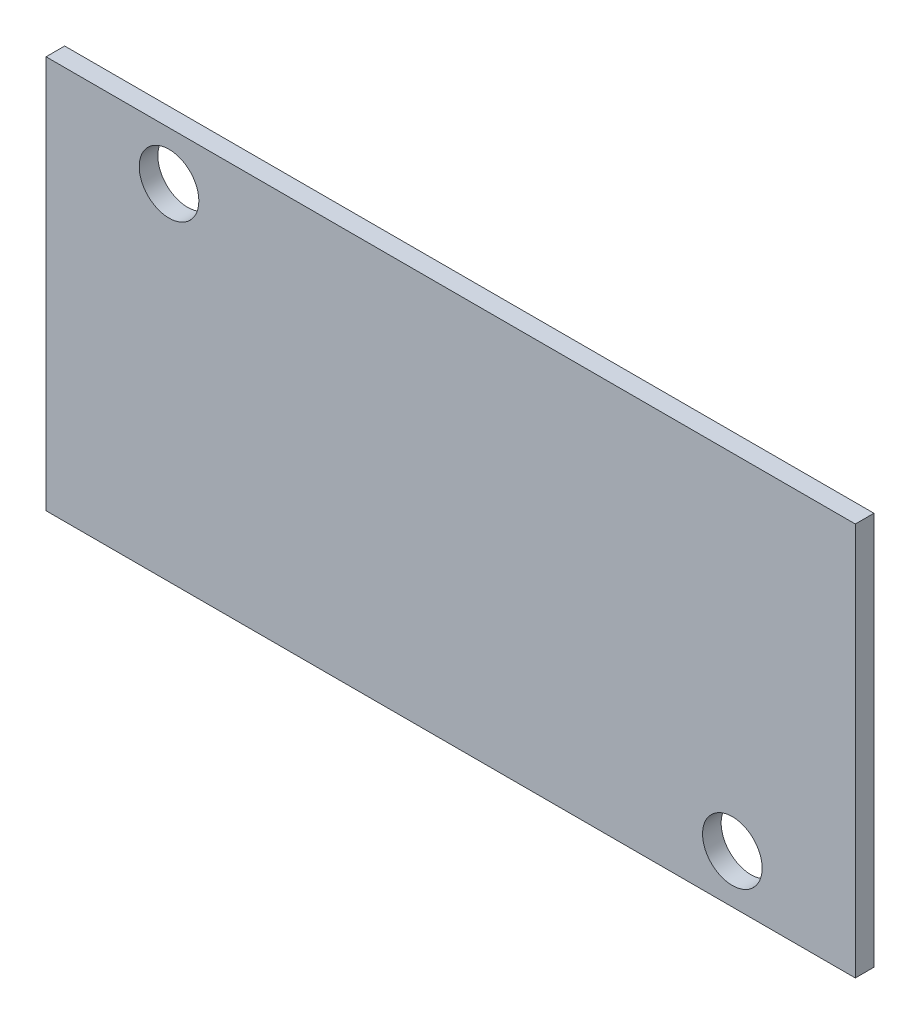
ISO-10303-21;
HEADER;
FILE_DESCRIPTION(('STEP AP214'),'2;1');
FILE_NAME('part.step','',(''),(''),'','','');
FILE_SCHEMA(('AUTOMOTIVE_DESIGN { 1 0 10303 214 1 1 1 1 }'));
ENDSEC;
DATA;
#1=APPLICATION_CONTEXT('core data for automotive mechanical design processes');
#2=APPLICATION_PROTOCOL_DEFINITION('international standard','automotive_design',2000,#1);
#3=PRODUCT_CONTEXT('',#1,'mechanical');
#4=PRODUCT('Part','Part','',(#3));
#5=PRODUCT_RELATED_PRODUCT_CATEGORY('part','',(#4));
#6=PRODUCT_DEFINITION_FORMATION('','',#4);
#7=PRODUCT_DEFINITION_CONTEXT('part definition',#1,'design');
#8=PRODUCT_DEFINITION('design','',#6,#7);
#9=PRODUCT_DEFINITION_SHAPE('','',#8);
#10=(LENGTH_UNIT() NAMED_UNIT(*) SI_UNIT(.MILLI.,.METRE.));
#11=(NAMED_UNIT(*) PLANE_ANGLE_UNIT() SI_UNIT($,.RADIAN.));
#12=(NAMED_UNIT(*) SI_UNIT($,.STERADIAN.) SOLID_ANGLE_UNIT());
#13=UNCERTAINTY_MEASURE_WITH_UNIT(LENGTH_MEASURE(1.E-05),#10,'distance_accuracy_value','');
#14=(GEOMETRIC_REPRESENTATION_CONTEXT(3) GLOBAL_UNCERTAINTY_ASSIGNED_CONTEXT((#13)) GLOBAL_UNIT_ASSIGNED_CONTEXT((#10,
#11,#12)) REPRESENTATION_CONTEXT('',''));
#15=CARTESIAN_POINT('',(0.,0.,0.));
#16=DIRECTION('',(0.,0.,1.));
#17=DIRECTION('',(1.,0.,0.));
#18=AXIS2_PLACEMENT_3D('',#15,#16,#17);
#19=CARTESIAN_POINT('',(0.,0.,1.));
#20=DIRECTION('',(0.,0.,1.));
#21=DIRECTION('',(1.,0.,0.));
#22=AXIS2_PLACEMENT_3D('',#19,#20,#21);
#23=PLANE('',#22);
#24=CARTESIAN_POINT('',(-15.115,7.95,1.));
#25=DIRECTION('',(0.,0.,1.));
#26=DIRECTION('',(1.,0.,0.));
#27=AXIS2_PLACEMENT_3D('',#24,#25,#26);
#28=CIRCLE('',#27,1.6);
#29=CARTESIAN_POINT('',(-13.515,7.95,1.));
#30=VERTEX_POINT('',#29);
#31=EDGE_CURVE('E102',#30,#30,#28,.T.);
#32=ORIENTED_EDGE('',*,*,#31,.F.);
#33=EDGE_LOOP('',(#32));
#34=FACE_BOUND('',#33,.T.);
#35=DIRECTION('',(0.,1.,0.));
#36=VECTOR('',#35,1.);
#37=CARTESIAN_POINT('',(21.715,10.55,1.));
#38=LINE('',#37,#36);
#39=CARTESIAN_POINT('',(21.715,-10.55,1.));
#40=VERTEX_POINT('',#39);
#41=CARTESIAN_POINT('',(21.715,10.55,1.));
#42=VERTEX_POINT('',#41);
#43=EDGE_CURVE('E87',#40,#42,#38,.T.);
#44=ORIENTED_EDGE('',*,*,#43,.T.);
#45=DIRECTION('',(-1.,0.,0.));
#46=VECTOR('',#45,1.);
#47=CARTESIAN_POINT('',(-21.715,10.55,1.));
#48=LINE('',#47,#46);
#49=CARTESIAN_POINT('',(-21.715,10.55,1.));
#50=VERTEX_POINT('',#49);
#51=EDGE_CURVE('E82',#42,#50,#48,.T.);
#52=ORIENTED_EDGE('',*,*,#51,.T.);
#53=DIRECTION('',(0.,-1.,0.));
#54=VECTOR('',#53,1.);
#55=CARTESIAN_POINT('',(-21.715,10.55,1.));
#56=LINE('',#55,#54);
#57=CARTESIAN_POINT('',(-21.715,-10.55,1.));
#58=VERTEX_POINT('',#57);
#59=EDGE_CURVE('E85',#50,#58,#56,.T.);
#60=ORIENTED_EDGE('',*,*,#59,.T.);
#61=DIRECTION('',(1.,0.,0.));
#62=VECTOR('',#61,1.);
#63=CARTESIAN_POINT('',(-21.715,-10.55,1.));
#64=LINE('',#63,#62);
#65=EDGE_CURVE('E52',#58,#40,#64,.T.);
#66=ORIENTED_EDGE('',*,*,#65,.T.);
#67=EDGE_LOOP('',(#44,#52,#60,#66));
#68=FACE_BOUND('',#67,.T.);
#69=CARTESIAN_POINT('',(15.115,-7.95,1.));
#70=DIRECTION('',(0.,0.,1.));
#71=DIRECTION('',(1.,0.,0.));
#72=AXIS2_PLACEMENT_3D('',#69,#70,#71);
#73=CIRCLE('',#72,1.6);
#74=CARTESIAN_POINT('',(16.715,-7.95,1.));
#75=VERTEX_POINT('',#74);
#76=EDGE_CURVE('E117',#75,#75,#73,.T.);
#77=ORIENTED_EDGE('',*,*,#76,.F.);
#78=EDGE_LOOP('',(#77));
#79=FACE_BOUND('',#78,.T.);
#80=ADVANCED_FACE('F35',(#34,#68,#79),#23,.T.);
#81=CARTESIAN_POINT('',(0.,0.,0.));
#82=DIRECTION('',(0.,0.,1.));
#83=DIRECTION('',(1.,0.,0.));
#84=AXIS2_PLACEMENT_3D('',#81,#82,#83);
#85=PLANE('',#84);
#86=DIRECTION('',(0.,1.,0.));
#87=VECTOR('',#86,1.);
#88=CARTESIAN_POINT('',(21.715,10.55,0.));
#89=LINE('',#88,#87);
#90=CARTESIAN_POINT('',(21.715,-10.55,0.));
#91=VERTEX_POINT('',#90);
#92=CARTESIAN_POINT('',(21.715,10.55,0.));
#93=VERTEX_POINT('',#92);
#94=EDGE_CURVE('E99',#91,#93,#89,.T.);
#95=ORIENTED_EDGE('',*,*,#94,.F.);
#96=DIRECTION('',(1.,0.,0.));
#97=VECTOR('',#96,1.);
#98=CARTESIAN_POINT('',(-21.715,-10.55,0.));
#99=LINE('',#98,#97);
#100=CARTESIAN_POINT('',(-21.715,-10.55,0.));
#101=VERTEX_POINT('',#100);
#102=EDGE_CURVE('E75',#101,#91,#99,.T.);
#103=ORIENTED_EDGE('',*,*,#102,.F.);
#104=DIRECTION('',(0.,-1.,0.));
#105=VECTOR('',#104,1.);
#106=CARTESIAN_POINT('',(-21.715,10.55,0.));
#107=LINE('',#106,#105);
#108=CARTESIAN_POINT('',(-21.715,10.55,0.));
#109=VERTEX_POINT('',#108);
#110=EDGE_CURVE('E69',#109,#101,#107,.T.);
#111=ORIENTED_EDGE('',*,*,#110,.F.);
#112=DIRECTION('',(-1.,0.,0.));
#113=VECTOR('',#112,1.);
#114=CARTESIAN_POINT('',(-21.715,10.55,0.));
#115=LINE('',#114,#113);
#116=EDGE_CURVE('E91',#93,#109,#115,.T.);
#117=ORIENTED_EDGE('',*,*,#116,.F.);
#118=EDGE_LOOP('',(#95,#103,#111,#117));
#119=FACE_BOUND('',#118,.T.);
#120=CARTESIAN_POINT('',(-15.115,7.95,0.));
#121=DIRECTION('',(0.,0.,1.));
#122=DIRECTION('',(1.,0.,0.));
#123=AXIS2_PLACEMENT_3D('',#120,#121,#122);
#124=CIRCLE('',#123,1.6);
#125=CARTESIAN_POINT('',(-13.515,7.95,0.));
#126=VERTEX_POINT('',#125);
#127=EDGE_CURVE('E114',#126,#126,#124,.T.);
#128=ORIENTED_EDGE('',*,*,#127,.T.);
#129=EDGE_LOOP('',(#128));
#130=FACE_BOUND('',#129,.T.);
#131=CARTESIAN_POINT('',(15.115,-7.95,0.));
#132=DIRECTION('',(0.,0.,1.));
#133=DIRECTION('',(1.,0.,0.));
#134=AXIS2_PLACEMENT_3D('',#131,#132,#133);
#135=CIRCLE('',#134,1.6);
#136=CARTESIAN_POINT('',(16.715,-7.95,0.));
#137=VERTEX_POINT('',#136);
#138=EDGE_CURVE('E120',#137,#137,#135,.T.);
#139=ORIENTED_EDGE('',*,*,#138,.T.);
#140=EDGE_LOOP('',(#139));
#141=FACE_BOUND('',#140,.T.);
#142=ADVANCED_FACE('F110',(#119,#130,#141),#85,.F.);
#143=CARTESIAN_POINT('',(21.715,10.55,1.));
#144=DIRECTION('',(-1.,0.,0.));
#145=DIRECTION('',(0.,-1.,0.));
#146=AXIS2_PLACEMENT_3D('',#143,#144,#145);
#147=PLANE('',#146);
#148=ORIENTED_EDGE('',*,*,#94,.T.);
#149=DIRECTION('',(0.,0.,-1.));
#150=VECTOR('',#149,1.);
#151=CARTESIAN_POINT('',(21.715,10.55,1.));
#152=LINE('',#151,#150);
#153=EDGE_CURVE('E11',#42,#93,#152,.T.);
#154=ORIENTED_EDGE('',*,*,#153,.F.);
#155=ORIENTED_EDGE('',*,*,#43,.F.);
#156=DIRECTION('',(0.,0.,-1.));
#157=VECTOR('',#156,1.);
#158=CARTESIAN_POINT('',(21.715,-10.55,1.));
#159=LINE('',#158,#157);
#160=EDGE_CURVE('E95',#40,#91,#159,.T.);
#161=ORIENTED_EDGE('',*,*,#160,.T.);
#162=EDGE_LOOP('',(#148,#154,#155,#161));
#163=FACE_BOUND('',#162,.T.);
#164=ADVANCED_FACE('F37',(#163),#147,.F.);
#165=CARTESIAN_POINT('',(-21.715,10.55,1.));
#166=DIRECTION('',(0.,-1.,0.));
#167=DIRECTION('',(0.,0.,-1.));
#168=AXIS2_PLACEMENT_3D('',#165,#166,#167);
#169=PLANE('',#168);
#170=ORIENTED_EDGE('',*,*,#116,.T.);
#171=DIRECTION('',(0.,0.,-1.));
#172=VECTOR('',#171,1.);
#173=CARTESIAN_POINT('',(-21.715,10.55,1.));
#174=LINE('',#173,#172);
#175=EDGE_CURVE('E44',#50,#109,#174,.T.);
#176=ORIENTED_EDGE('',*,*,#175,.F.);
#177=ORIENTED_EDGE('',*,*,#51,.F.);
#178=ORIENTED_EDGE('',*,*,#153,.T.);
#179=EDGE_LOOP('',(#170,#176,#177,#178));
#180=FACE_BOUND('',#179,.T.);
#181=ADVANCED_FACE('F90',(#180),#169,.F.);
#182=CARTESIAN_POINT('',(-21.715,10.55,1.));
#183=DIRECTION('',(1.,0.,0.));
#184=DIRECTION('',(0.,1.,0.));
#185=AXIS2_PLACEMENT_3D('',#182,#183,#184);
#186=PLANE('',#185);
#187=ORIENTED_EDGE('',*,*,#110,.T.);
#188=DIRECTION('',(0.,0.,-1.));
#189=VECTOR('',#188,1.);
#190=CARTESIAN_POINT('',(-21.715,-10.55,1.));
#191=LINE('',#190,#189);
#192=EDGE_CURVE('E92',#58,#101,#191,.T.);
#193=ORIENTED_EDGE('',*,*,#192,.F.);
#194=ORIENTED_EDGE('',*,*,#59,.F.);
#195=ORIENTED_EDGE('',*,*,#175,.T.);
#196=EDGE_LOOP('',(#187,#193,#194,#195));
#197=FACE_BOUND('',#196,.T.);
#198=ADVANCED_FACE('F93',(#197),#186,.F.);
#199=CARTESIAN_POINT('',(-21.715,-10.55,1.));
#200=DIRECTION('',(0.,1.,0.));
#201=DIRECTION('',(0.,0.,1.));
#202=AXIS2_PLACEMENT_3D('',#199,#200,#201);
#203=PLANE('',#202);
#204=ORIENTED_EDGE('',*,*,#102,.T.);
#205=ORIENTED_EDGE('',*,*,#160,.F.);
#206=ORIENTED_EDGE('',*,*,#65,.F.);
#207=ORIENTED_EDGE('',*,*,#192,.T.);
#208=EDGE_LOOP('',(#204,#205,#206,#207));
#209=FACE_BOUND('',#208,.T.);
#210=ADVANCED_FACE('F107',(#209),#203,.F.);
#211=CARTESIAN_POINT('',(-15.115,7.95,1.));
#212=DIRECTION('',(0.,0.,-1.));
#213=DIRECTION('',(-1.,0.,0.));
#214=AXIS2_PLACEMENT_3D('',#211,#212,#213);
#215=CYLINDRICAL_SURFACE('',#214,1.6);
#216=ORIENTED_EDGE('',*,*,#31,.T.);
#217=EDGE_LOOP('',(#216));
#218=FACE_BOUND('',#217,.T.);
#219=ORIENTED_EDGE('',*,*,#127,.F.);
#220=EDGE_LOOP('',(#219));
#221=FACE_BOUND('',#220,.T.);
#222=ADVANCED_FACE('F137',(#218,#221),#215,.F.);
#223=CARTESIAN_POINT('',(15.115,-7.95,1.));
#224=DIRECTION('',(0.,0.,-1.));
#225=DIRECTION('',(-1.,0.,0.));
#226=AXIS2_PLACEMENT_3D('',#223,#224,#225);
#227=CYLINDRICAL_SURFACE('',#226,1.6);
#228=ORIENTED_EDGE('',*,*,#76,.T.);
#229=EDGE_LOOP('',(#228));
#230=FACE_BOUND('',#229,.T.);
#231=ORIENTED_EDGE('',*,*,#138,.F.);
#232=EDGE_LOOP('',(#231));
#233=FACE_BOUND('',#232,.T.);
#234=ADVANCED_FACE('F126',(#230,#233),#227,.F.);
#235=CLOSED_SHELL('',(#80,#142,#164,#181,#198,#210,#222,#234));
#236=MANIFOLD_SOLID_BREP('B2',#235);
#237=ADVANCED_BREP_SHAPE_REPRESENTATION('',(#18,#236),#14);
#238=SHAPE_DEFINITION_REPRESENTATION(#9,#237);
ENDSEC;
END-ISO-10303-21;
